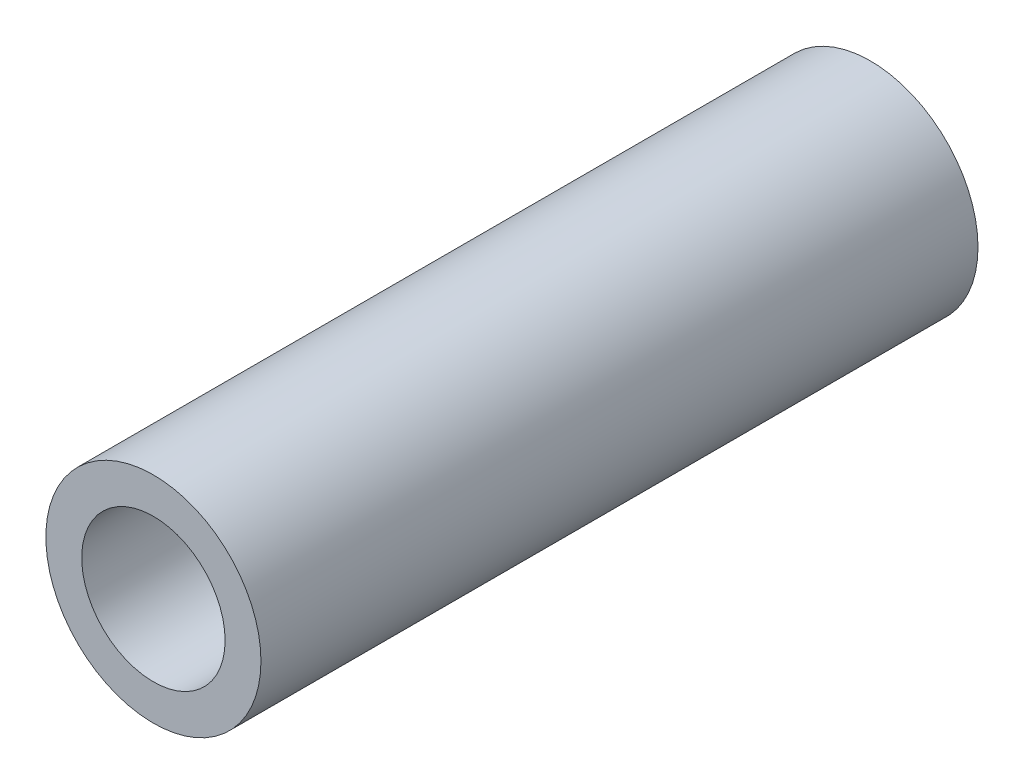
ISO-10303-21;
HEADER;
FILE_DESCRIPTION(('STEP AP214'),'2;1');
FILE_NAME('part.step','',(''),(''),'','','');
FILE_SCHEMA(('AUTOMOTIVE_DESIGN { 1 0 10303 214 1 1 1 1 }'));
ENDSEC;
DATA;
#1=APPLICATION_CONTEXT('core data for automotive mechanical design processes');
#2=APPLICATION_PROTOCOL_DEFINITION('international standard','automotive_design',2000,#1);
#3=PRODUCT_CONTEXT('',#1,'mechanical');
#4=PRODUCT('Part','Part','',(#3));
#5=PRODUCT_RELATED_PRODUCT_CATEGORY('part','',(#4));
#6=PRODUCT_DEFINITION_FORMATION('','',#4);
#7=PRODUCT_DEFINITION_CONTEXT('part definition',#1,'design');
#8=PRODUCT_DEFINITION('design','',#6,#7);
#9=PRODUCT_DEFINITION_SHAPE('','',#8);
#10=(LENGTH_UNIT() NAMED_UNIT(*) SI_UNIT(.MILLI.,.METRE.));
#11=(NAMED_UNIT(*) PLANE_ANGLE_UNIT() SI_UNIT($,.RADIAN.));
#12=(NAMED_UNIT(*) SI_UNIT($,.STERADIAN.) SOLID_ANGLE_UNIT());
#13=UNCERTAINTY_MEASURE_WITH_UNIT(LENGTH_MEASURE(1.E-05),#10,'distance_accuracy_value','');
#14=(GEOMETRIC_REPRESENTATION_CONTEXT(3) GLOBAL_UNCERTAINTY_ASSIGNED_CONTEXT((#13)) GLOBAL_UNIT_ASSIGNED_CONTEXT((#10,
#11,#12)) REPRESENTATION_CONTEXT('',''));
#15=CARTESIAN_POINT('',(0.,0.,0.));
#16=DIRECTION('',(0.,0.,1.));
#17=DIRECTION('',(1.,0.,0.));
#18=AXIS2_PLACEMENT_3D('',#15,#16,#17);
#19=CARTESIAN_POINT('',(0.,0.,20.));
#20=DIRECTION('',(0.,0.,1.));
#21=DIRECTION('',(1.,0.,0.));
#22=AXIS2_PLACEMENT_3D('',#19,#20,#21);
#23=PLANE('',#22);
#24=CARTESIAN_POINT('',(0.,0.,20.));
#25=DIRECTION('',(0.,0.,1.));
#26=DIRECTION('',(1.,0.,0.));
#27=AXIS2_PLACEMENT_3D('',#24,#25,#26);
#28=CIRCLE('',#27,3.);
#29=CARTESIAN_POINT('',(3.,0.,20.));
#30=VERTEX_POINT('',#29);
#31=EDGE_CURVE('E10',#30,#30,#28,.T.);
#32=ORIENTED_EDGE('',*,*,#31,.T.);
#33=EDGE_LOOP('',(#32));
#34=FACE_BOUND('',#33,.T.);
#35=CARTESIAN_POINT('',(0.,0.,20.));
#36=DIRECTION('',(0.,0.,1.));
#37=DIRECTION('',(1.,0.,0.));
#38=AXIS2_PLACEMENT_3D('',#35,#36,#37);
#39=CIRCLE('',#38,2.);
#40=CARTESIAN_POINT('',(2.,0.,20.));
#41=VERTEX_POINT('',#40);
#42=EDGE_CURVE('E44',#41,#41,#39,.T.);
#43=ORIENTED_EDGE('',*,*,#42,.F.);
#44=EDGE_LOOP('',(#43));
#45=FACE_BOUND('',#44,.T.);
#46=ADVANCED_FACE('F33',(#34,#45),#23,.T.);
#47=CARTESIAN_POINT('',(0.,0.,0.));
#48=DIRECTION('',(0.,0.,1.));
#49=DIRECTION('',(1.,0.,0.));
#50=AXIS2_PLACEMENT_3D('',#47,#48,#49);
#51=PLANE('',#50);
#52=CARTESIAN_POINT('',(0.,0.,0.));
#53=DIRECTION('',(0.,0.,1.));
#54=DIRECTION('',(1.,0.,0.));
#55=AXIS2_PLACEMENT_3D('',#52,#53,#54);
#56=CIRCLE('',#55,3.);
#57=CARTESIAN_POINT('',(3.,0.,0.));
#58=VERTEX_POINT('',#57);
#59=EDGE_CURVE('E37',#58,#58,#56,.T.);
#60=ORIENTED_EDGE('',*,*,#59,.F.);
#61=EDGE_LOOP('',(#60));
#62=FACE_BOUND('',#61,.T.);
#63=CARTESIAN_POINT('',(0.,0.,0.));
#64=DIRECTION('',(0.,0.,1.));
#65=DIRECTION('',(1.,0.,0.));
#66=AXIS2_PLACEMENT_3D('',#63,#64,#65);
#67=CIRCLE('',#66,2.);
#68=CARTESIAN_POINT('',(2.,0.,0.));
#69=VERTEX_POINT('',#68);
#70=EDGE_CURVE('E46',#69,#69,#67,.T.);
#71=ORIENTED_EDGE('',*,*,#70,.T.);
#72=EDGE_LOOP('',(#71));
#73=FACE_BOUND('',#72,.T.);
#74=ADVANCED_FACE('F56',(#62,#73),#51,.F.);
#75=CARTESIAN_POINT('',(0.,0.,20.));
#76=DIRECTION('',(0.,0.,-1.));
#77=DIRECTION('',(-1.,0.,0.));
#78=AXIS2_PLACEMENT_3D('',#75,#76,#77);
#79=CYLINDRICAL_SURFACE('',#78,3.);
#80=ORIENTED_EDGE('',*,*,#31,.F.);
#81=EDGE_LOOP('',(#80));
#82=FACE_BOUND('',#81,.T.);
#83=ORIENTED_EDGE('',*,*,#59,.T.);
#84=EDGE_LOOP('',(#83));
#85=FACE_BOUND('',#84,.T.);
#86=ADVANCED_FACE('F35',(#82,#85),#79,.T.);
#87=CARTESIAN_POINT('',(0.,0.,20.));
#88=DIRECTION('',(0.,0.,-1.));
#89=DIRECTION('',(-1.,0.,0.));
#90=AXIS2_PLACEMENT_3D('',#87,#88,#89);
#91=CYLINDRICAL_SURFACE('',#90,2.);
#92=ORIENTED_EDGE('',*,*,#42,.T.);
#93=EDGE_LOOP('',(#92));
#94=FACE_BOUND('',#93,.T.);
#95=ORIENTED_EDGE('',*,*,#70,.F.);
#96=EDGE_LOOP('',(#95));
#97=FACE_BOUND('',#96,.T.);
#98=ADVANCED_FACE('F52',(#94,#97),#91,.F.);
#99=CLOSED_SHELL('',(#46,#74,#86,#98));
#100=MANIFOLD_SOLID_BREP('B2',#99);
#101=ADVANCED_BREP_SHAPE_REPRESENTATION('',(#18,#100),#14);
#102=SHAPE_DEFINITION_REPRESENTATION(#9,#101);
ENDSEC;
END-ISO-10303-21;
